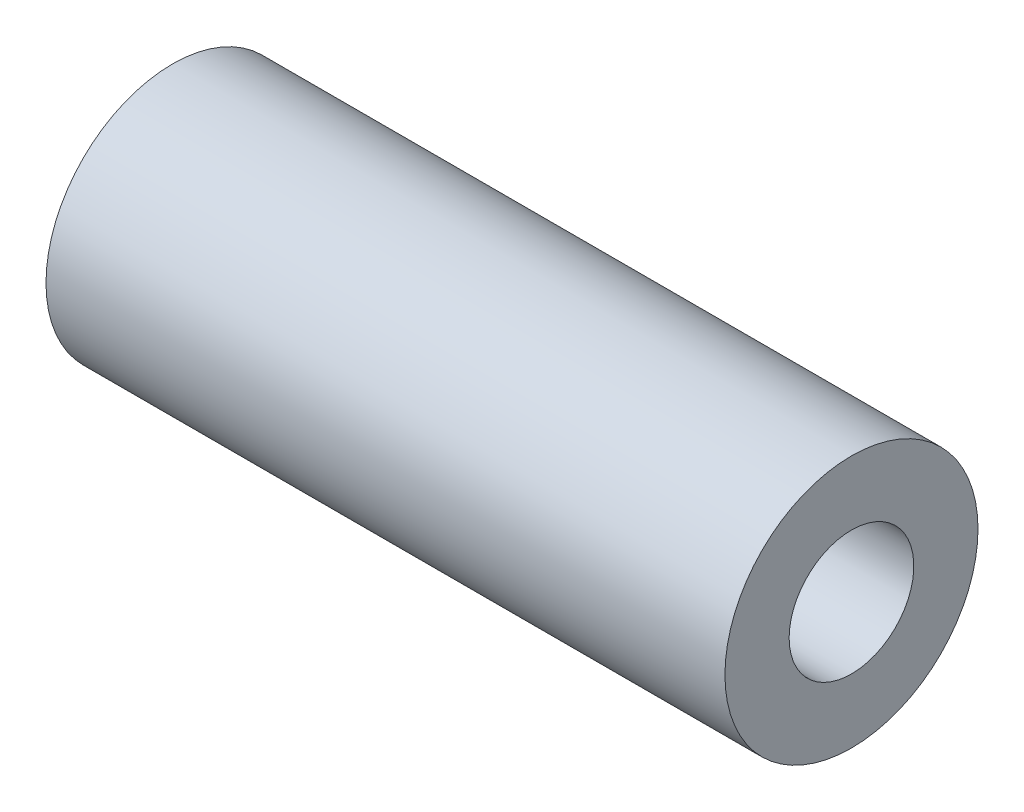
ISO-10303-21;
HEADER;
FILE_DESCRIPTION(('STEP AP214'),'2;1');
FILE_NAME('part.step','',(''),(''),'','','');
FILE_SCHEMA(('AUTOMOTIVE_DESIGN { 1 0 10303 214 1 1 1 1 }'));
ENDSEC;
DATA;
#1=APPLICATION_CONTEXT('core data for automotive mechanical design processes');
#2=APPLICATION_PROTOCOL_DEFINITION('international standard','automotive_design',2000,#1);
#3=PRODUCT_CONTEXT('',#1,'mechanical');
#4=PRODUCT('Part','Part','',(#3));
#5=PRODUCT_RELATED_PRODUCT_CATEGORY('part','',(#4));
#6=PRODUCT_DEFINITION_FORMATION('','',#4);
#7=PRODUCT_DEFINITION_CONTEXT('part definition',#1,'design');
#8=PRODUCT_DEFINITION('design','',#6,#7);
#9=PRODUCT_DEFINITION_SHAPE('','',#8);
#10=(LENGTH_UNIT() NAMED_UNIT(*) SI_UNIT(.MILLI.,.METRE.));
#11=(NAMED_UNIT(*) PLANE_ANGLE_UNIT() SI_UNIT($,.RADIAN.));
#12=(NAMED_UNIT(*) SI_UNIT($,.STERADIAN.) SOLID_ANGLE_UNIT());
#13=UNCERTAINTY_MEASURE_WITH_UNIT(LENGTH_MEASURE(1.E-05),#10,'distance_accuracy_value','');
#14=(GEOMETRIC_REPRESENTATION_CONTEXT(3) GLOBAL_UNCERTAINTY_ASSIGNED_CONTEXT((#13)) GLOBAL_UNIT_ASSIGNED_CONTEXT((#10,
#11,#12)) REPRESENTATION_CONTEXT('',''));
#15=CARTESIAN_POINT('',(0.,0.,0.));
#16=DIRECTION('',(0.,0.,1.));
#17=DIRECTION('',(1.,0.,0.));
#18=AXIS2_PLACEMENT_3D('',#15,#16,#17);
#19=CARTESIAN_POINT('',(-61.,0.,0.));
#20=DIRECTION('',(-1.,0.,0.));
#21=DIRECTION('',(0.,0.,1.));
#22=AXIS2_PLACEMENT_3D('',#19,#20,#21);
#23=PLANE('',#22);
#24=CARTESIAN_POINT('',(-61.,-5.05,0.));
#25=DIRECTION('',(-1.,0.,0.));
#26=DIRECTION('',(0.,0.,1.));
#27=AXIS2_PLACEMENT_3D('',#24,#25,#26);
#28=CIRCLE('',#27,10.25);
#29=CARTESIAN_POINT('',(-61.,-5.05,10.25));
#30=VERTEX_POINT('',#29);
#31=EDGE_CURVE('E10',#30,#30,#28,.T.);
#32=ORIENTED_EDGE('',*,*,#31,.T.);
#33=EDGE_LOOP('',(#32));
#34=FACE_BOUND('',#33,.T.);
#35=CARTESIAN_POINT('',(-61.,-5.05,0.));
#36=DIRECTION('',(-1.,0.,0.));
#37=DIRECTION('',(0.,0.,1.));
#38=AXIS2_PLACEMENT_3D('',#35,#36,#37);
#39=CIRCLE('',#38,5.05);
#40=CARTESIAN_POINT('',(-61.,-5.05,5.05));
#41=VERTEX_POINT('',#40);
#42=EDGE_CURVE('E48',#41,#41,#39,.T.);
#43=ORIENTED_EDGE('',*,*,#42,.F.);
#44=EDGE_LOOP('',(#43));
#45=FACE_BOUND('',#44,.T.);
#46=ADVANCED_FACE('F34',(#34,#45),#23,.T.);
#47=CARTESIAN_POINT('',(-62.9132326413719,-5.05,0.));
#48=DIRECTION('',(-1.,0.,0.));
#49=DIRECTION('',(0.,0.,1.));
#50=AXIS2_PLACEMENT_3D('',#47,#48,#49);
#51=CYLINDRICAL_SURFACE('',#50,10.25);
#52=CARTESIAN_POINT('',(-6.,-5.05,0.));
#53=DIRECTION('',(-1.,0.,0.));
#54=DIRECTION('',(0.,0.,1.));
#55=AXIS2_PLACEMENT_3D('',#52,#53,#54);
#56=CIRCLE('',#55,10.25);
#57=CARTESIAN_POINT('',(-6.,-5.05,10.25));
#58=VERTEX_POINT('',#57);
#59=EDGE_CURVE('E40',#58,#58,#56,.T.);
#60=ORIENTED_EDGE('',*,*,#59,.T.);
#61=EDGE_LOOP('',(#60));
#62=FACE_BOUND('',#61,.T.);
#63=ORIENTED_EDGE('',*,*,#31,.F.);
#64=EDGE_LOOP('',(#63));
#65=FACE_BOUND('',#64,.T.);
#66=ADVANCED_FACE('F57',(#62,#65),#51,.T.);
#67=CARTESIAN_POINT('',(-6.,5.2,0.));
#68=DIRECTION('',(1.,0.,0.));
#69=DIRECTION('',(0.,0.,-1.));
#70=AXIS2_PLACEMENT_3D('',#67,#68,#69);
#71=PLANE('',#70);
#72=CARTESIAN_POINT('',(-6.00000000000001,-5.05,0.));
#73=DIRECTION('',(-1.,0.,0.));
#74=DIRECTION('',(0.,0.,1.));
#75=AXIS2_PLACEMENT_3D('',#72,#73,#74);
#76=CIRCLE('',#75,5.05);
#77=CARTESIAN_POINT('',(-6.00000000000001,-5.05,5.05));
#78=VERTEX_POINT('',#77);
#79=EDGE_CURVE('E44',#78,#78,#76,.T.);
#80=ORIENTED_EDGE('',*,*,#79,.T.);
#81=EDGE_LOOP('',(#80));
#82=FACE_BOUND('',#81,.T.);
#83=ORIENTED_EDGE('',*,*,#59,.F.);
#84=EDGE_LOOP('',(#83));
#85=FACE_BOUND('',#84,.T.);
#86=ADVANCED_FACE('F61',(#82,#85),#71,.T.);
#87=CARTESIAN_POINT('',(-62.9132326413719,-5.05,0.));
#88=DIRECTION('',(-1.,0.,0.));
#89=DIRECTION('',(0.,0.,1.));
#90=AXIS2_PLACEMENT_3D('',#87,#88,#89);
#91=CYLINDRICAL_SURFACE('',#90,5.05);
#92=ORIENTED_EDGE('',*,*,#79,.F.);
#93=EDGE_LOOP('',(#92));
#94=FACE_BOUND('',#93,.T.);
#95=ORIENTED_EDGE('',*,*,#42,.T.);
#96=EDGE_LOOP('',(#95));
#97=FACE_BOUND('',#96,.T.);
#98=ADVANCED_FACE('F54',(#94,#97),#91,.F.);
#99=CLOSED_SHELL('',(#46,#66,#86,#98));
#100=MANIFOLD_SOLID_BREP('B2',#99);
#101=ADVANCED_BREP_SHAPE_REPRESENTATION('',(#18,#100),#14);
#102=SHAPE_DEFINITION_REPRESENTATION(#9,#101);
ENDSEC;
END-ISO-10303-21;
